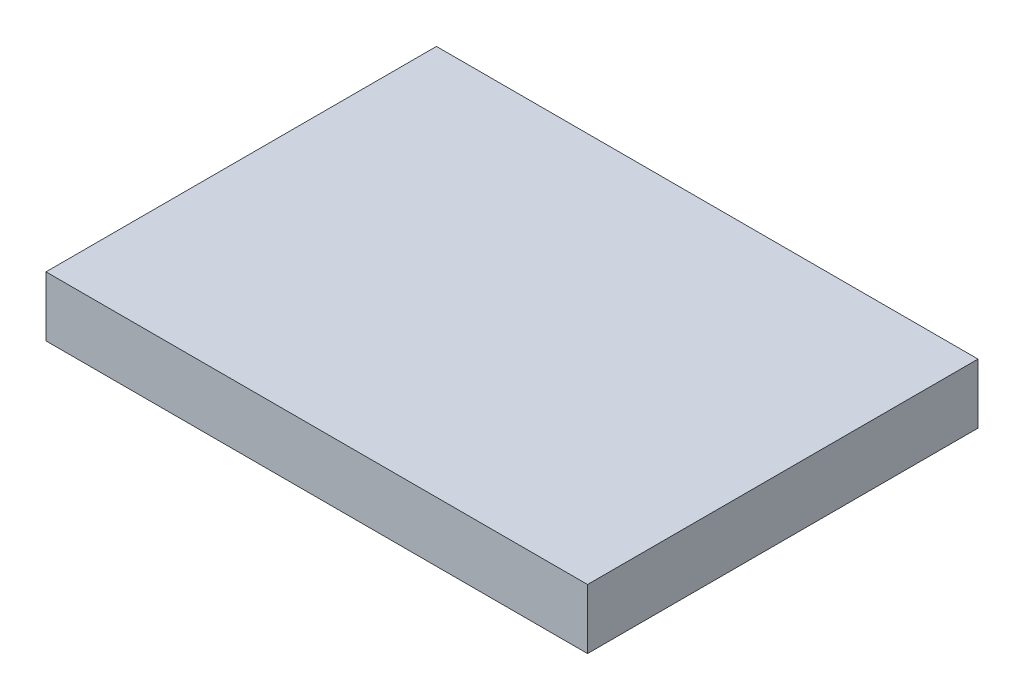
ISO-10303-21;
HEADER;
FILE_DESCRIPTION(('STEP AP214'),'2;1');
FILE_NAME('part.step','',(''),(''),'','','');
FILE_SCHEMA(('AUTOMOTIVE_DESIGN { 1 0 10303 214 1 1 1 1 }'));
ENDSEC;
DATA;
#1=APPLICATION_CONTEXT('core data for automotive mechanical design processes');
#2=APPLICATION_PROTOCOL_DEFINITION('international standard','automotive_design',2000,#1);
#3=PRODUCT_CONTEXT('',#1,'mechanical');
#4=PRODUCT('Part','Part','',(#3));
#5=PRODUCT_RELATED_PRODUCT_CATEGORY('part','',(#4));
#6=PRODUCT_DEFINITION_FORMATION('','',#4);
#7=PRODUCT_DEFINITION_CONTEXT('part definition',#1,'design');
#8=PRODUCT_DEFINITION('design','',#6,#7);
#9=PRODUCT_DEFINITION_SHAPE('','',#8);
#10=(LENGTH_UNIT() NAMED_UNIT(*) SI_UNIT(.MILLI.,.METRE.));
#11=(NAMED_UNIT(*) PLANE_ANGLE_UNIT() SI_UNIT($,.RADIAN.));
#12=(NAMED_UNIT(*) SI_UNIT($,.STERADIAN.) SOLID_ANGLE_UNIT());
#13=UNCERTAINTY_MEASURE_WITH_UNIT(LENGTH_MEASURE(1.E-05),#10,'distance_accuracy_value','');
#14=(GEOMETRIC_REPRESENTATION_CONTEXT(3) GLOBAL_UNCERTAINTY_ASSIGNED_CONTEXT((#13)) GLOBAL_UNIT_ASSIGNED_CONTEXT((#10,
#11,#12)) REPRESENTATION_CONTEXT('',''));
#15=CARTESIAN_POINT('',(0.,0.,0.));
#16=DIRECTION('',(0.,0.,1.));
#17=DIRECTION('',(1.,0.,0.));
#18=AXIS2_PLACEMENT_3D('',#15,#16,#17);
#19=CARTESIAN_POINT('',(-180.,1.,-130.));
#20=DIRECTION('',(0.,0.,-1.));
#21=DIRECTION('',(-1.,0.,0.));
#22=AXIS2_PLACEMENT_3D('',#19,#20,#21);
#23=PLANE('',#22);
#24=DIRECTION('',(1.,0.,0.));
#25=VECTOR('',#24,1.);
#26=CARTESIAN_POINT('',(-180.,0.,-130.));
#27=LINE('',#26,#25);
#28=CARTESIAN_POINT('',(-180.,0.,-130.));
#29=VERTEX_POINT('',#28);
#30=CARTESIAN_POINT('',(180.,0.,-130.));
#31=VERTEX_POINT('',#30);
#32=EDGE_CURVE('E55',#29,#31,#27,.T.);
#33=ORIENTED_EDGE('',*,*,#32,.F.);
#34=DIRECTION('',(0.,-1.,0.));
#35=VECTOR('',#34,1.);
#36=CARTESIAN_POINT('',(-180.,1.,-130.));
#37=LINE('',#36,#35);
#38=CARTESIAN_POINT('',(-180.,-39.,-130.));
#39=VERTEX_POINT('',#38);
#40=EDGE_CURVE('E63',#29,#39,#37,.T.);
#41=ORIENTED_EDGE('',*,*,#40,.T.);
#42=DIRECTION('',(1.,0.,0.));
#43=VECTOR('',#42,1.);
#44=CARTESIAN_POINT('',(-181.,-39.,-130.));
#45=LINE('',#44,#43);
#46=CARTESIAN_POINT('',(-181.,-39.,-130.));
#47=VERTEX_POINT('',#46);
#48=EDGE_CURVE('E172',#47,#39,#45,.T.);
#49=ORIENTED_EDGE('',*,*,#48,.F.);
#50=DIRECTION('',(0.,-1.,0.));
#51=VECTOR('',#50,1.);
#52=CARTESIAN_POINT('',(-181.,1.,-130.));
#53=LINE('',#52,#51);
#54=CARTESIAN_POINT('',(-181.,1.,-130.));
#55=VERTEX_POINT('',#54);
#56=EDGE_CURVE('E112',#55,#47,#53,.T.);
#57=ORIENTED_EDGE('',*,*,#56,.F.);
#58=DIRECTION('',(1.,0.,0.));
#59=VECTOR('',#58,1.);
#60=CARTESIAN_POINT('',(-180.,1.,-130.));
#61=LINE('',#60,#59);
#62=CARTESIAN_POINT('',(181.,1.,-130.));
#63=VERTEX_POINT('',#62);
#64=EDGE_CURVE('E11',#55,#63,#61,.T.);
#65=ORIENTED_EDGE('',*,*,#64,.T.);
#66=DIRECTION('',(0.,1.,0.));
#67=VECTOR('',#66,1.);
#68=CARTESIAN_POINT('',(181.,1.,-130.));
#69=LINE('',#68,#67);
#70=CARTESIAN_POINT('',(181.,-39.,-130.));
#71=VERTEX_POINT('',#70);
#72=EDGE_CURVE('E109',#71,#63,#69,.T.);
#73=ORIENTED_EDGE('',*,*,#72,.F.);
#74=DIRECTION('',(-1.,0.,0.));
#75=VECTOR('',#74,1.);
#76=CARTESIAN_POINT('',(181.,-39.,-130.));
#77=LINE('',#76,#75);
#78=CARTESIAN_POINT('',(180.,-39.,-130.));
#79=VERTEX_POINT('',#78);
#80=EDGE_CURVE('E141',#71,#79,#77,.T.);
#81=ORIENTED_EDGE('',*,*,#80,.T.);
#82=DIRECTION('',(0.,1.,0.));
#83=VECTOR('',#82,1.);
#84=CARTESIAN_POINT('',(180.,1.,-130.));
#85=LINE('',#84,#83);
#86=EDGE_CURVE('E134',#79,#31,#85,.T.);
#87=ORIENTED_EDGE('',*,*,#86,.T.);
#88=EDGE_LOOP('',(#33,#41,#49,#57,#65,#73,#81,#87));
#89=FACE_BOUND('',#88,.T.);
#90=ADVANCED_FACE('F39',(#89),#23,.T.);
#91=CARTESIAN_POINT('',(0.,1.,0.));
#92=DIRECTION('',(0.,-1.,0.));
#93=DIRECTION('',(0.,0.,-1.));
#94=AXIS2_PLACEMENT_3D('',#91,#92,#93);
#95=PLANE('',#94);
#96=ORIENTED_EDGE('',*,*,#64,.F.);
#97=DIRECTION('',(0.,0.,-1.));
#98=VECTOR('',#97,1.);
#99=CARTESIAN_POINT('',(-181.,1.,-130.));
#100=LINE('',#99,#98);
#101=CARTESIAN_POINT('',(-181.,1.,131.));
#102=VERTEX_POINT('',#101);
#103=EDGE_CURVE('E169',#102,#55,#100,.T.);
#104=ORIENTED_EDGE('',*,*,#103,.F.);
#105=DIRECTION('',(-1.,0.,0.));
#106=VECTOR('',#105,1.);
#107=CARTESIAN_POINT('',(180.,1.,131.));
#108=LINE('',#107,#106);
#109=CARTESIAN_POINT('',(181.,1.,131.));
#110=VERTEX_POINT('',#109);
#111=EDGE_CURVE('E119',#110,#102,#108,.T.);
#112=ORIENTED_EDGE('',*,*,#111,.F.);
#113=DIRECTION('',(0.,0.,1.));
#114=VECTOR('',#113,1.);
#115=CARTESIAN_POINT('',(181.,1.,-130.));
#116=LINE('',#115,#114);
#117=EDGE_CURVE('E116',#63,#110,#116,.T.);
#118=ORIENTED_EDGE('',*,*,#117,.F.);
#119=EDGE_LOOP('',(#96,#104,#112,#118));
#120=FACE_BOUND('',#119,.T.);
#121=ADVANCED_FACE('F117',(#120),#95,.F.);
#122=CARTESIAN_POINT('',(0.,0.,0.));
#123=DIRECTION('',(0.,-1.,0.));
#124=DIRECTION('',(0.,0.,-1.));
#125=AXIS2_PLACEMENT_3D('',#122,#123,#124);
#126=PLANE('',#125);
#127=DIRECTION('',(0.,0.,-1.));
#128=VECTOR('',#127,1.);
#129=CARTESIAN_POINT('',(-180.,0.,130.));
#130=LINE('',#129,#128);
#131=CARTESIAN_POINT('',(-180.,0.,130.));
#132=VERTEX_POINT('',#131);
#133=EDGE_CURVE('E183',#132,#29,#130,.T.);
#134=ORIENTED_EDGE('',*,*,#133,.T.);
#135=ORIENTED_EDGE('',*,*,#32,.T.);
#136=DIRECTION('',(0.,0.,-1.));
#137=VECTOR('',#136,1.);
#138=CARTESIAN_POINT('',(180.,0.,130.));
#139=LINE('',#138,#137);
#140=CARTESIAN_POINT('',(180.,0.,130.));
#141=VERTEX_POINT('',#140);
#142=EDGE_CURVE('E188',#141,#31,#139,.T.);
#143=ORIENTED_EDGE('',*,*,#142,.F.);
#144=DIRECTION('',(1.,0.,0.));
#145=VECTOR('',#144,1.);
#146=CARTESIAN_POINT('',(-180.,0.,130.));
#147=LINE('',#146,#145);
#148=EDGE_CURVE('E42',#132,#141,#147,.T.);
#149=ORIENTED_EDGE('',*,*,#148,.F.);
#150=EDGE_LOOP('',(#134,#135,#143,#149));
#151=FACE_BOUND('',#150,.T.);
#152=ADVANCED_FACE('F199',(#151),#126,.T.);
#153=CARTESIAN_POINT('',(-181.,-39.,-130.));
#154=DIRECTION('',(0.,1.,0.));
#155=DIRECTION('',(0.,0.,1.));
#156=AXIS2_PLACEMENT_3D('',#153,#154,#155);
#157=PLANE('',#156);
#158=DIRECTION('',(0.,0.,1.));
#159=VECTOR('',#158,1.);
#160=CARTESIAN_POINT('',(-180.,-39.,-130.));
#161=LINE('',#160,#159);
#162=CARTESIAN_POINT('',(-180.,-39.,130.));
#163=VERTEX_POINT('',#162);
#164=EDGE_CURVE('E175',#39,#163,#161,.T.);
#165=ORIENTED_EDGE('',*,*,#164,.T.);
#166=DIRECTION('',(1.,0.,0.));
#167=VECTOR('',#166,1.);
#168=CARTESIAN_POINT('',(180.,-39.,130.));
#169=LINE('',#168,#167);
#170=CARTESIAN_POINT('',(180.,-39.,130.));
#171=VERTEX_POINT('',#170);
#172=EDGE_CURVE('E151',#163,#171,#169,.T.);
#173=ORIENTED_EDGE('',*,*,#172,.T.);
#174=DIRECTION('',(0.,0.,-1.));
#175=VECTOR('',#174,1.);
#176=CARTESIAN_POINT('',(180.,-39.,-130.));
#177=LINE('',#176,#175);
#178=EDGE_CURVE('E131',#171,#79,#177,.T.);
#179=ORIENTED_EDGE('',*,*,#178,.T.);
#180=ORIENTED_EDGE('',*,*,#80,.F.);
#181=DIRECTION('',(0.,0.,-1.));
#182=VECTOR('',#181,1.);
#183=CARTESIAN_POINT('',(181.,-39.,-130.));
#184=LINE('',#183,#182);
#185=CARTESIAN_POINT('',(181.,-39.,131.));
#186=VERTEX_POINT('',#185);
#187=EDGE_CURVE('E128',#186,#71,#184,.T.);
#188=ORIENTED_EDGE('',*,*,#187,.F.);
#189=DIRECTION('',(1.,0.,0.));
#190=VECTOR('',#189,1.);
#191=CARTESIAN_POINT('',(180.,-39.,131.));
#192=LINE('',#191,#190);
#193=CARTESIAN_POINT('',(-181.,-39.,131.));
#194=VERTEX_POINT('',#193);
#195=EDGE_CURVE('E155',#194,#186,#192,.T.);
#196=ORIENTED_EDGE('',*,*,#195,.F.);
#197=DIRECTION('',(0.,0.,1.));
#198=VECTOR('',#197,1.);
#199=CARTESIAN_POINT('',(-181.,-39.,-130.));
#200=LINE('',#199,#198);
#201=EDGE_CURVE('E165',#47,#194,#200,.T.);
#202=ORIENTED_EDGE('',*,*,#201,.F.);
#203=ORIENTED_EDGE('',*,*,#48,.T.);
#204=EDGE_LOOP('',(#165,#173,#179,#180,#188,#196,#202,#203));
#205=FACE_BOUND('',#204,.T.);
#206=ADVANCED_FACE('F202',(#205),#157,.F.);
#207=CARTESIAN_POINT('',(-181.,0.,0.));
#208=DIRECTION('',(-1.,0.,0.));
#209=DIRECTION('',(0.,0.,1.));
#210=AXIS2_PLACEMENT_3D('',#207,#208,#209);
#211=PLANE('',#210);
#212=ORIENTED_EDGE('',*,*,#56,.T.);
#213=ORIENTED_EDGE('',*,*,#201,.T.);
#214=DIRECTION('',(0.,-1.,0.));
#215=VECTOR('',#214,1.);
#216=CARTESIAN_POINT('',(-181.,1.,131.));
#217=LINE('',#216,#215);
#218=EDGE_CURVE('E150',#102,#194,#217,.T.);
#219=ORIENTED_EDGE('',*,*,#218,.F.);
#220=ORIENTED_EDGE('',*,*,#103,.T.);
#221=EDGE_LOOP('',(#212,#213,#219,#220));
#222=FACE_BOUND('',#221,.T.);
#223=ADVANCED_FACE('F207',(#222),#211,.T.);
#224=CARTESIAN_POINT('',(-180.,0.,0.));
#225=DIRECTION('',(-1.,0.,0.));
#226=DIRECTION('',(0.,0.,1.));
#227=AXIS2_PLACEMENT_3D('',#224,#225,#226);
#228=PLANE('',#227);
#229=ORIENTED_EDGE('',*,*,#133,.F.);
#230=DIRECTION('',(0.,1.,0.));
#231=VECTOR('',#230,1.);
#232=CARTESIAN_POINT('',(-180.,1.,130.));
#233=LINE('',#232,#231);
#234=EDGE_CURVE('E166',#163,#132,#233,.T.);
#235=ORIENTED_EDGE('',*,*,#234,.F.);
#236=ORIENTED_EDGE('',*,*,#164,.F.);
#237=ORIENTED_EDGE('',*,*,#40,.F.);
#238=EDGE_LOOP('',(#229,#235,#236,#237));
#239=FACE_BOUND('',#238,.T.);
#240=ADVANCED_FACE('F203',(#239),#228,.F.);
#241=CARTESIAN_POINT('',(0.,0.,131.));
#242=DIRECTION('',(0.,0.,-1.));
#243=DIRECTION('',(-1.,0.,0.));
#244=AXIS2_PLACEMENT_3D('',#241,#242,#243);
#245=PLANE('',#244);
#246=ORIENTED_EDGE('',*,*,#195,.T.);
#247=DIRECTION('',(0.,-1.,0.));
#248=VECTOR('',#247,1.);
#249=CARTESIAN_POINT('',(181.,1.,131.));
#250=LINE('',#249,#248);
#251=EDGE_CURVE('E124',#110,#186,#250,.T.);
#252=ORIENTED_EDGE('',*,*,#251,.F.);
#253=ORIENTED_EDGE('',*,*,#111,.T.);
#254=ORIENTED_EDGE('',*,*,#218,.T.);
#255=EDGE_LOOP('',(#246,#252,#253,#254));
#256=FACE_BOUND('',#255,.T.);
#257=ADVANCED_FACE('F209',(#256),#245,.F.);
#258=CARTESIAN_POINT('',(0.,0.,130.));
#259=DIRECTION('',(0.,0.,-1.));
#260=DIRECTION('',(-1.,0.,0.));
#261=AXIS2_PLACEMENT_3D('',#258,#259,#260);
#262=PLANE('',#261);
#263=ORIENTED_EDGE('',*,*,#234,.T.);
#264=ORIENTED_EDGE('',*,*,#148,.T.);
#265=DIRECTION('',(0.,1.,0.));
#266=VECTOR('',#265,1.);
#267=CARTESIAN_POINT('',(180.,1.,130.));
#268=LINE('',#267,#266);
#269=EDGE_CURVE('E147',#171,#141,#268,.T.);
#270=ORIENTED_EDGE('',*,*,#269,.F.);
#271=ORIENTED_EDGE('',*,*,#172,.F.);
#272=EDGE_LOOP('',(#263,#264,#270,#271));
#273=FACE_BOUND('',#272,.T.);
#274=ADVANCED_FACE('F195',(#273),#262,.T.);
#275=CARTESIAN_POINT('',(181.,0.,0.));
#276=DIRECTION('',(-1.,0.,0.));
#277=DIRECTION('',(0.,0.,1.));
#278=AXIS2_PLACEMENT_3D('',#275,#276,#277);
#279=PLANE('',#278);
#280=ORIENTED_EDGE('',*,*,#72,.T.);
#281=ORIENTED_EDGE('',*,*,#117,.T.);
#282=ORIENTED_EDGE('',*,*,#251,.T.);
#283=ORIENTED_EDGE('',*,*,#187,.T.);
#284=EDGE_LOOP('',(#280,#281,#282,#283));
#285=FACE_BOUND('',#284,.T.);
#286=ADVANCED_FACE('F126',(#285),#279,.F.);
#287=CARTESIAN_POINT('',(180.,0.,0.));
#288=DIRECTION('',(-1.,0.,0.));
#289=DIRECTION('',(0.,0.,1.));
#290=AXIS2_PLACEMENT_3D('',#287,#288,#289);
#291=PLANE('',#290);
#292=ORIENTED_EDGE('',*,*,#269,.T.);
#293=ORIENTED_EDGE('',*,*,#142,.T.);
#294=ORIENTED_EDGE('',*,*,#86,.F.);
#295=ORIENTED_EDGE('',*,*,#178,.F.);
#296=EDGE_LOOP('',(#292,#293,#294,#295));
#297=FACE_BOUND('',#296,.T.);
#298=ADVANCED_FACE('F200',(#297),#291,.T.);
#299=CLOSED_SHELL('',(#90,#121,#152,#206,#223,#240,#257,#274,#286,#298));
#300=MANIFOLD_SOLID_BREP('B2',#299);
#301=ADVANCED_BREP_SHAPE_REPRESENTATION('',(#18,#300),#14);
#302=SHAPE_DEFINITION_REPRESENTATION(#9,#301);
ENDSEC;
END-ISO-10303-21;
